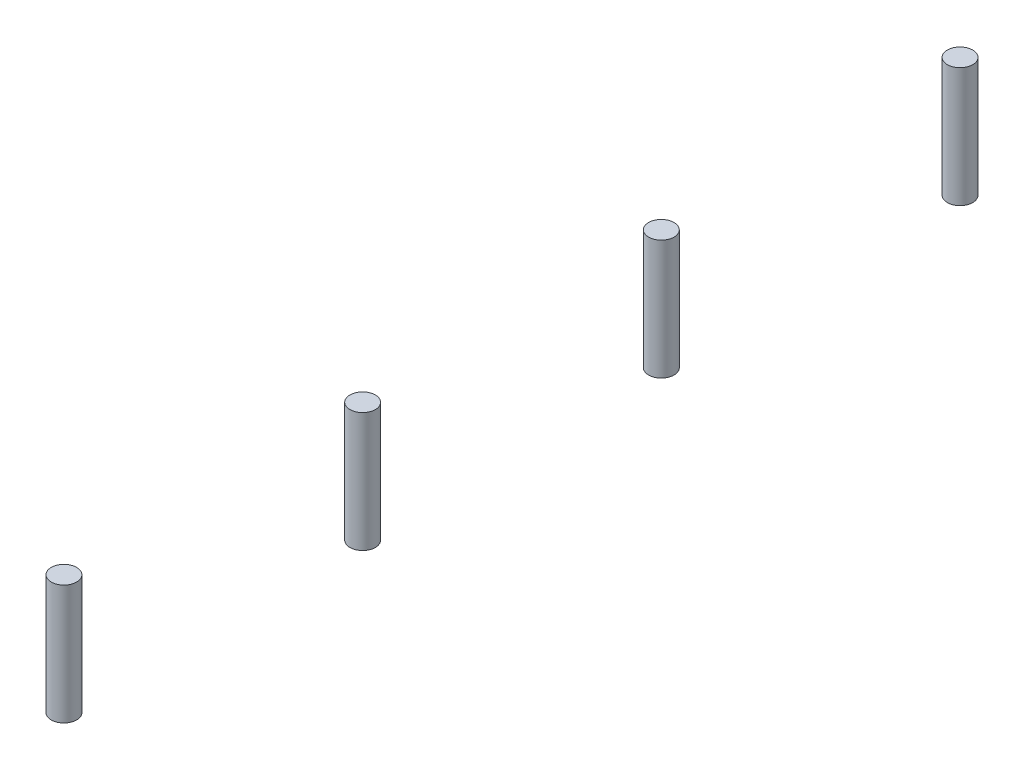
ISO-10303-21;
HEADER;
FILE_DESCRIPTION(('STEP AP214'),'2;1');
FILE_NAME('part.step','',(''),(''),'','','');
FILE_SCHEMA(('AUTOMOTIVE_DESIGN { 1 0 10303 214 1 1 1 1 }'));
ENDSEC;
DATA;
#1=APPLICATION_CONTEXT('core data for automotive mechanical design processes');
#2=APPLICATION_PROTOCOL_DEFINITION('international standard','automotive_design',2000,#1);
#3=PRODUCT_CONTEXT('',#1,'mechanical');
#4=PRODUCT('Part','Part','',(#3));
#5=PRODUCT_RELATED_PRODUCT_CATEGORY('part','',(#4));
#6=PRODUCT_DEFINITION_FORMATION('','',#4);
#7=PRODUCT_DEFINITION_CONTEXT('part definition',#1,'design');
#8=PRODUCT_DEFINITION('design','',#6,#7);
#9=PRODUCT_DEFINITION_SHAPE('','',#8);
#10=(LENGTH_UNIT() NAMED_UNIT(*) SI_UNIT(.MILLI.,.METRE.));
#11=(NAMED_UNIT(*) PLANE_ANGLE_UNIT() SI_UNIT($,.RADIAN.));
#12=(NAMED_UNIT(*) SI_UNIT($,.STERADIAN.) SOLID_ANGLE_UNIT());
#13=UNCERTAINTY_MEASURE_WITH_UNIT(LENGTH_MEASURE(1.E-05),#10,'distance_accuracy_value','');
#14=(GEOMETRIC_REPRESENTATION_CONTEXT(3) GLOBAL_UNCERTAINTY_ASSIGNED_CONTEXT((#13)) GLOBAL_UNIT_ASSIGNED_CONTEXT((#10,
#11,#12)) REPRESENTATION_CONTEXT('',''));
#15=CARTESIAN_POINT('',(0.,0.,0.));
#16=DIRECTION('',(0.,0.,1.));
#17=DIRECTION('',(1.,0.,0.));
#18=AXIS2_PLACEMENT_3D('',#15,#16,#17);
#19=CARTESIAN_POINT('',(-1.00000000000011,4.,-35.));
#20=DIRECTION('',(0.,-1.,0.));
#21=DIRECTION('',(0.,0.,-1.));
#22=AXIS2_PLACEMENT_3D('',#19,#20,#21);
#23=CYLINDRICAL_SURFACE('',#22,0.425000000000004);
#24=CARTESIAN_POINT('',(-1.00000000000011,4.,-35.));
#25=DIRECTION('',(0.,1.,0.));
#26=DIRECTION('',(0.,0.,1.));
#27=AXIS2_PLACEMENT_3D('',#24,#25,#26);
#28=CIRCLE('',#27,0.425000000000004);
#29=CARTESIAN_POINT('',(-1.00000000000011,4.,-34.575));
#30=VERTEX_POINT('',#29);
#31=EDGE_CURVE('E54',#30,#30,#28,.T.);
#32=ORIENTED_EDGE('',*,*,#31,.F.);
#33=EDGE_LOOP('',(#32));
#34=FACE_BOUND('',#33,.T.);
#35=CARTESIAN_POINT('',(-1.00000000000011,0.,-35.));
#36=DIRECTION('',(0.,1.,0.));
#37=DIRECTION('',(0.,0.,1.));
#38=AXIS2_PLACEMENT_3D('',#35,#36,#37);
#39=CIRCLE('',#38,0.425000000000004);
#40=CARTESIAN_POINT('',(-1.00000000000011,0.,-34.575));
#41=VERTEX_POINT('',#40);
#42=EDGE_CURVE('E11',#41,#41,#39,.T.);
#43=ORIENTED_EDGE('',*,*,#42,.T.);
#44=EDGE_LOOP('',(#43));
#45=FACE_BOUND('',#44,.T.);
#46=ADVANCED_FACE('F50',(#34,#45),#23,.T.);
#47=CARTESIAN_POINT('',(-1.00000000000011,4.,-35.));
#48=DIRECTION('',(0.,1.,0.));
#49=DIRECTION('',(0.,0.,1.));
#50=AXIS2_PLACEMENT_3D('',#47,#48,#49);
#51=PLANE('',#50);
#52=ORIENTED_EDGE('',*,*,#31,.T.);
#53=EDGE_LOOP('',(#52));
#54=FACE_BOUND('',#53,.T.);
#55=ADVANCED_FACE('F52',(#54),#51,.T.);
#56=CARTESIAN_POINT('',(-1.00000000000011,0.,-35.));
#57=DIRECTION('',(0.,1.,0.));
#58=DIRECTION('',(0.,0.,1.));
#59=AXIS2_PLACEMENT_3D('',#56,#57,#58);
#60=PLANE('',#59);
#61=ORIENTED_EDGE('',*,*,#42,.F.);
#62=EDGE_LOOP('',(#61));
#63=FACE_BOUND('',#62,.T.);
#64=ADVANCED_FACE('F71',(#63),#60,.F.);
#65=CLOSED_SHELL('',(#46,#55,#64));
#66=MANIFOLD_SOLID_BREP('B2',#65);
#67=CARTESIAN_POINT('',(-1.00000000000007,4.,-25.));
#68=DIRECTION('',(0.,-1.,0.));
#69=DIRECTION('',(0.,0.,-1.));
#70=AXIS2_PLACEMENT_3D('',#67,#68,#69);
#71=CYLINDRICAL_SURFACE('',#70,0.425000000000004);
#72=CARTESIAN_POINT('',(-1.00000000000007,4.,-25.));
#73=DIRECTION('',(0.,1.,0.));
#74=DIRECTION('',(0.,0.,1.));
#75=AXIS2_PLACEMENT_3D('',#72,#73,#74);
#76=CIRCLE('',#75,0.425000000000004);
#77=CARTESIAN_POINT('',(-1.00000000000007,4.,-24.575));
#78=VERTEX_POINT('',#77);
#79=EDGE_CURVE('E111',#78,#78,#76,.T.);
#80=ORIENTED_EDGE('',*,*,#79,.F.);
#81=EDGE_LOOP('',(#80));
#82=FACE_BOUND('',#81,.T.);
#83=CARTESIAN_POINT('',(-1.00000000000007,0.,-25.));
#84=DIRECTION('',(0.,1.,0.));
#85=DIRECTION('',(0.,0.,1.));
#86=AXIS2_PLACEMENT_3D('',#83,#84,#85);
#87=CIRCLE('',#86,0.425000000000004);
#88=CARTESIAN_POINT('',(-1.00000000000007,0.,-24.575));
#89=VERTEX_POINT('',#88);
#90=EDGE_CURVE('E49',#89,#89,#87,.T.);
#91=ORIENTED_EDGE('',*,*,#90,.T.);
#92=EDGE_LOOP('',(#91));
#93=FACE_BOUND('',#92,.T.);
#94=ADVANCED_FACE('F107',(#82,#93),#71,.T.);
#95=CARTESIAN_POINT('',(-1.00000000000007,4.,-25.));
#96=DIRECTION('',(0.,1.,0.));
#97=DIRECTION('',(0.,0.,1.));
#98=AXIS2_PLACEMENT_3D('',#95,#96,#97);
#99=PLANE('',#98);
#100=ORIENTED_EDGE('',*,*,#79,.T.);
#101=EDGE_LOOP('',(#100));
#102=FACE_BOUND('',#101,.T.);
#103=ADVANCED_FACE('F109',(#102),#99,.T.);
#104=CARTESIAN_POINT('',(-1.00000000000007,0.,-25.));
#105=DIRECTION('',(0.,1.,0.));
#106=DIRECTION('',(0.,0.,1.));
#107=AXIS2_PLACEMENT_3D('',#104,#105,#106);
#108=PLANE('',#107);
#109=ORIENTED_EDGE('',*,*,#90,.F.);
#110=EDGE_LOOP('',(#109));
#111=FACE_BOUND('',#110,.T.);
#112=ADVANCED_FACE('F126',(#111),#108,.F.);
#113=CLOSED_SHELL('',(#94,#103,#112));
#114=MANIFOLD_SOLID_BREP('B6',#113);
#115=CARTESIAN_POINT('',(-1.00000000000004,4.,-15.));
#116=DIRECTION('',(0.,-1.,0.));
#117=DIRECTION('',(0.,0.,-1.));
#118=AXIS2_PLACEMENT_3D('',#115,#116,#117);
#119=CYLINDRICAL_SURFACE('',#118,0.425000000000003);
#120=CARTESIAN_POINT('',(-1.00000000000004,4.,-15.));
#121=DIRECTION('',(0.,1.,0.));
#122=DIRECTION('',(0.,0.,1.));
#123=AXIS2_PLACEMENT_3D('',#120,#121,#122);
#124=CIRCLE('',#123,0.425000000000003);
#125=CARTESIAN_POINT('',(-1.00000000000004,4.,-14.575));
#126=VERTEX_POINT('',#125);
#127=EDGE_CURVE('E165',#126,#126,#124,.T.);
#128=ORIENTED_EDGE('',*,*,#127,.F.);
#129=EDGE_LOOP('',(#128));
#130=FACE_BOUND('',#129,.T.);
#131=CARTESIAN_POINT('',(-1.00000000000004,0.,-15.));
#132=DIRECTION('',(0.,1.,0.));
#133=DIRECTION('',(0.,0.,1.));
#134=AXIS2_PLACEMENT_3D('',#131,#132,#133);
#135=CIRCLE('',#134,0.425000000000003);
#136=CARTESIAN_POINT('',(-1.00000000000004,0.,-14.575));
#137=VERTEX_POINT('',#136);
#138=EDGE_CURVE('E106',#137,#137,#135,.T.);
#139=ORIENTED_EDGE('',*,*,#138,.T.);
#140=EDGE_LOOP('',(#139));
#141=FACE_BOUND('',#140,.T.);
#142=ADVANCED_FACE('F161',(#130,#141),#119,.T.);
#143=CARTESIAN_POINT('',(-1.00000000000004,4.,-15.));
#144=DIRECTION('',(0.,1.,0.));
#145=DIRECTION('',(0.,0.,1.));
#146=AXIS2_PLACEMENT_3D('',#143,#144,#145);
#147=PLANE('',#146);
#148=ORIENTED_EDGE('',*,*,#127,.T.);
#149=EDGE_LOOP('',(#148));
#150=FACE_BOUND('',#149,.T.);
#151=ADVANCED_FACE('F163',(#150),#147,.T.);
#152=CARTESIAN_POINT('',(-1.00000000000004,0.,-15.));
#153=DIRECTION('',(0.,1.,0.));
#154=DIRECTION('',(0.,0.,1.));
#155=AXIS2_PLACEMENT_3D('',#152,#153,#154);
#156=PLANE('',#155);
#157=ORIENTED_EDGE('',*,*,#138,.F.);
#158=EDGE_LOOP('',(#157));
#159=FACE_BOUND('',#158,.T.);
#160=ADVANCED_FACE('F180',(#159),#156,.F.);
#161=CLOSED_SHELL('',(#142,#151,#160));
#162=MANIFOLD_SOLID_BREP('B44',#161);
#163=CARTESIAN_POINT('',(-1.,4.,-4.99999999999999));
#164=DIRECTION('',(0.,-1.,0.));
#165=DIRECTION('',(0.,0.,-1.));
#166=AXIS2_PLACEMENT_3D('',#163,#164,#165);
#167=CYLINDRICAL_SURFACE('',#166,0.425000000000003);
#168=CARTESIAN_POINT('',(-1.,4.,-4.99999999999999));
#169=DIRECTION('',(0.,1.,0.));
#170=DIRECTION('',(0.,0.,1.));
#171=AXIS2_PLACEMENT_3D('',#168,#169,#170);
#172=CIRCLE('',#171,0.425000000000003);
#173=CARTESIAN_POINT('',(-1.,4.,-4.57499999999999));
#174=VERTEX_POINT('',#173);
#175=EDGE_CURVE('E160',#174,#174,#172,.T.);
#176=ORIENTED_EDGE('',*,*,#175,.F.);
#177=EDGE_LOOP('',(#176));
#178=FACE_BOUND('',#177,.T.);
#179=CARTESIAN_POINT('',(-1.,0.,-4.99999999999999));
#180=DIRECTION('',(0.,1.,0.));
#181=DIRECTION('',(0.,0.,1.));
#182=AXIS2_PLACEMENT_3D('',#179,#180,#181);
#183=CIRCLE('',#182,0.425000000000003);
#184=CARTESIAN_POINT('',(-1.,0.,-4.57499999999999));
#185=VERTEX_POINT('',#184);
#186=EDGE_CURVE('E211',#185,#185,#183,.T.);
#187=ORIENTED_EDGE('',*,*,#186,.T.);
#188=EDGE_LOOP('',(#187));
#189=FACE_BOUND('',#188,.T.);
#190=ADVANCED_FACE('F208',(#178,#189),#167,.T.);
#191=CARTESIAN_POINT('',(-1.,4.,-4.99999999999999));
#192=DIRECTION('',(0.,1.,0.));
#193=DIRECTION('',(0.,0.,1.));
#194=AXIS2_PLACEMENT_3D('',#191,#192,#193);
#195=PLANE('',#194);
#196=ORIENTED_EDGE('',*,*,#175,.T.);
#197=EDGE_LOOP('',(#196));
#198=FACE_BOUND('',#197,.T.);
#199=ADVANCED_FACE('F223',(#198),#195,.T.);
#200=CARTESIAN_POINT('',(-1.,0.,-4.99999999999999));
#201=DIRECTION('',(0.,1.,0.));
#202=DIRECTION('',(0.,0.,1.));
#203=AXIS2_PLACEMENT_3D('',#200,#201,#202);
#204=PLANE('',#203);
#205=ORIENTED_EDGE('',*,*,#186,.F.);
#206=EDGE_LOOP('',(#205));
#207=FACE_BOUND('',#206,.T.);
#208=ADVANCED_FACE('F221',(#207),#204,.F.);
#209=CLOSED_SHELL('',(#190,#199,#208));
#210=MANIFOLD_SOLID_BREP('B101',#209);
#211=ADVANCED_BREP_SHAPE_REPRESENTATION('',(#18,#66,#114,#162,#210),#14);
#212=SHAPE_DEFINITION_REPRESENTATION(#9,#211);
ENDSEC;
END-ISO-10303-21;
